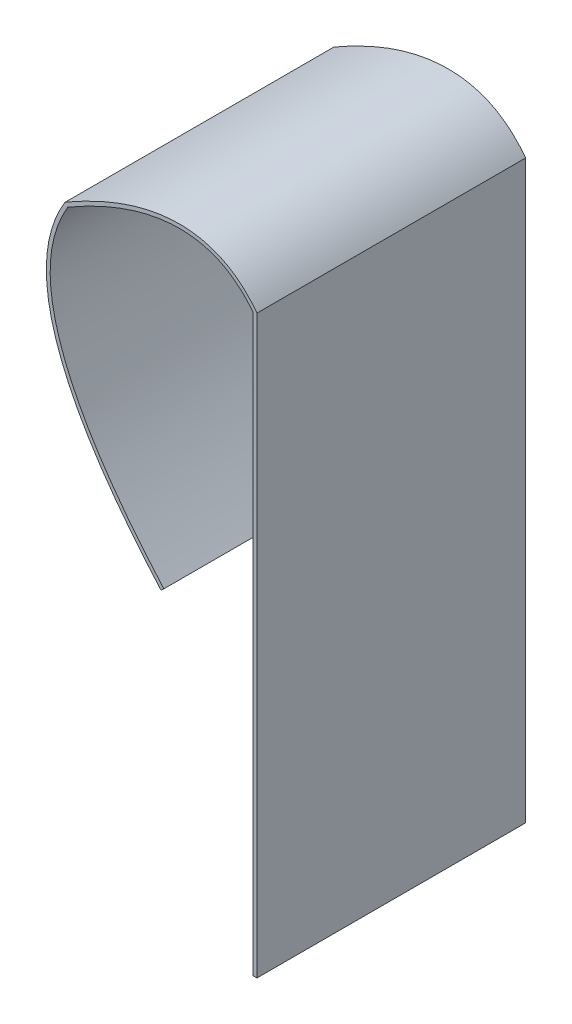
ISO-10303-21;
HEADER;
FILE_DESCRIPTION(('STEP AP214'),'2;1');
FILE_NAME('part.step','',(''),(''),'','','');
FILE_SCHEMA(('AUTOMOTIVE_DESIGN { 1 0 10303 214 1 1 1 1 }'));
ENDSEC;
DATA;
#1=APPLICATION_CONTEXT('core data for automotive mechanical design processes');
#2=APPLICATION_PROTOCOL_DEFINITION('international standard','automotive_design',2000,#1);
#3=PRODUCT_CONTEXT('',#1,'mechanical');
#4=PRODUCT('Part','Part','',(#3));
#5=PRODUCT_RELATED_PRODUCT_CATEGORY('part','',(#4));
#6=PRODUCT_DEFINITION_FORMATION('','',#4);
#7=PRODUCT_DEFINITION_CONTEXT('part definition',#1,'design');
#8=PRODUCT_DEFINITION('design','',#6,#7);
#9=PRODUCT_DEFINITION_SHAPE('','',#8);
#10=(LENGTH_UNIT() NAMED_UNIT(*) SI_UNIT(.MILLI.,.METRE.));
#11=(NAMED_UNIT(*) PLANE_ANGLE_UNIT() SI_UNIT($,.RADIAN.));
#12=(NAMED_UNIT(*) SI_UNIT($,.STERADIAN.) SOLID_ANGLE_UNIT());
#13=UNCERTAINTY_MEASURE_WITH_UNIT(LENGTH_MEASURE(1.E-05),#10,'distance_accuracy_value','');
#14=(GEOMETRIC_REPRESENTATION_CONTEXT(3) GLOBAL_UNCERTAINTY_ASSIGNED_CONTEXT((#13)) GLOBAL_UNIT_ASSIGNED_CONTEXT((#10,
#11,#12)) REPRESENTATION_CONTEXT('',''));
#15=CARTESIAN_POINT('',(0.,0.,0.));
#16=DIRECTION('',(0.,0.,1.));
#17=DIRECTION('',(1.,0.,0.));
#18=AXIS2_PLACEMENT_3D('',#15,#16,#17);
#19=CARTESIAN_POINT('',(2.5,7.5,3.5));
#20=DIRECTION('',(-1.,0.,0.));
#21=DIRECTION('',(0.,-1.,0.));
#22=AXIS2_PLACEMENT_3D('',#19,#20,#21);
#23=PLANE('',#22);
#24=DIRECTION('',(0.,1.,0.));
#25=VECTOR('',#24,1.);
#26=CARTESIAN_POINT('',(2.5,7.5,-3.5));
#27=LINE('',#26,#25);
#28=CARTESIAN_POINT('',(2.5,-7.5,-3.5));
#29=VERTEX_POINT('',#28);
#30=CARTESIAN_POINT('',(2.5,7.5,-3.5));
#31=VERTEX_POINT('',#30);
#32=EDGE_CURVE('E132',#29,#31,#27,.T.);
#33=ORIENTED_EDGE('',*,*,#32,.T.);
#34=DIRECTION('',(0.,0.,-1.));
#35=VECTOR('',#34,1.);
#36=CARTESIAN_POINT('',(2.5,7.5,3.5));
#37=LINE('',#36,#35);
#38=CARTESIAN_POINT('',(2.5,7.5,3.5));
#39=VERTEX_POINT('',#38);
#40=EDGE_CURVE('E11',#39,#31,#37,.T.);
#41=ORIENTED_EDGE('',*,*,#40,.F.);
#42=DIRECTION('',(0.,1.,0.));
#43=VECTOR('',#42,1.);
#44=CARTESIAN_POINT('',(2.5,7.5,3.5));
#45=LINE('',#44,#43);
#46=CARTESIAN_POINT('',(2.5,-7.5,3.5));
#47=VERTEX_POINT('',#46);
#48=EDGE_CURVE('E166',#47,#39,#45,.T.);
#49=ORIENTED_EDGE('',*,*,#48,.F.);
#50=DIRECTION('',(0.,0.,-1.));
#51=VECTOR('',#50,1.);
#52=CARTESIAN_POINT('',(2.5,-7.5,3.5));
#53=LINE('',#52,#51);
#54=EDGE_CURVE('E125',#47,#29,#53,.T.);
#55=ORIENTED_EDGE('',*,*,#54,.T.);
#56=EDGE_LOOP('',(#33,#41,#49,#55));
#57=FACE_BOUND('',#56,.T.);
#58=ADVANCED_FACE('F33',(#57),#23,.F.);
#59=CARTESIAN_POINT('',(2.5,7.5,3.5));
#60=CARTESIAN_POINT('',(2.01260655887463,8.14822429448387,3.5));
#61=CARTESIAN_POINT('',(0.732089956286287,9.38809723966888,3.5));
#62=CARTESIAN_POINT('',(-2.5,7.5,3.5));
#63=B_SPLINE_CURVE_WITH_KNOTS('',3,(#59,#60,#61,#62),.UNSPECIFIED.,.F.,.F.,(4,4),(0.,
0.389137860695649),.UNSPECIFIED.);
#64=DIRECTION('',(0.,0.,-1.));
#65=VECTOR('',#64,1.);
#66=SURFACE_OF_LINEAR_EXTRUSION('',#63,#65);
#67=CARTESIAN_POINT('',(2.5,7.5,-3.5));
#68=CARTESIAN_POINT('',(2.01260655887463,8.14822429448387,-3.5));
#69=CARTESIAN_POINT('',(0.732089956286287,9.38809723966888,-3.5));
#70=CARTESIAN_POINT('',(-2.5,7.5,-3.5));
#71=B_SPLINE_CURVE_WITH_KNOTS('',3,(#67,#68,#69,#70),.UNSPECIFIED.,.F.,.F.,(4,4),(0.,
0.389137860695649),.UNSPECIFIED.);
#72=CARTESIAN_POINT('',(-2.5,7.5,-3.5));
#73=VERTEX_POINT('',#72);
#74=EDGE_CURVE('E135',#31,#73,#71,.T.);
#75=ORIENTED_EDGE('',*,*,#74,.T.);
#76=DIRECTION('',(0.,0.,-1.));
#77=VECTOR('',#76,1.);
#78=CARTESIAN_POINT('',(-2.5,7.5,3.5));
#79=LINE('',#78,#77);
#80=CARTESIAN_POINT('',(-2.5,7.5,3.5));
#81=VERTEX_POINT('',#80);
#82=EDGE_CURVE('E41',#81,#73,#79,.T.);
#83=ORIENTED_EDGE('',*,*,#82,.F.);
#84=EDGE_CURVE('E92',#39,#81,#63,.T.);
#85=ORIENTED_EDGE('',*,*,#84,.F.);
#86=ORIENTED_EDGE('',*,*,#40,.T.);
#87=EDGE_LOOP('',(#75,#83,#85,#86));
#88=FACE_BOUND('',#87,.T.);
#89=ADVANCED_FACE('F210',(#88),#66,.F.);
#90=CARTESIAN_POINT('',(-2.5,7.5,3.5));
#91=CARTESIAN_POINT('',(-4.1911650932924,4.73119521828875,3.5));
#92=CARTESIAN_POINT('',(0.,0.,3.5));
#93=B_SPLINE_CURVE_WITH_KNOTS('',2,(#90,#91,#92),.UNSPECIFIED.,.F.,.F.,(3,3),(0.,1.),.UNSPECIFIED.);
#94=DIRECTION('',(0.,0.,-1.));
#95=VECTOR('',#94,1.);
#96=SURFACE_OF_LINEAR_EXTRUSION('',#93,#95);
#97=CARTESIAN_POINT('',(-2.5,7.5,-3.5));
#98=CARTESIAN_POINT('',(-4.1911650932924,4.73119521828875,-3.5));
#99=CARTESIAN_POINT('',(0.,0.,-3.5));
#100=B_SPLINE_CURVE_WITH_KNOTS('',2,(#97,#98,#99),.UNSPECIFIED.,.F.,.F.,(3,3),(0.,1.),.UNSPECIFIED.);
#101=CARTESIAN_POINT('',(0.,0.,-3.5));
#102=VERTEX_POINT('',#101);
#103=EDGE_CURVE('E139',#73,#102,#100,.T.);
#104=ORIENTED_EDGE('',*,*,#103,.T.);
#105=DIRECTION('',(0.,0.,-1.));
#106=VECTOR('',#105,1.);
#107=CARTESIAN_POINT('',(0.,0.,3.5));
#108=LINE('',#107,#106);
#109=CARTESIAN_POINT('',(0.,0.,3.5));
#110=VERTEX_POINT('',#109);
#111=EDGE_CURVE('E173',#110,#102,#108,.T.);
#112=ORIENTED_EDGE('',*,*,#111,.F.);
#113=EDGE_CURVE('E181',#81,#110,#93,.T.);
#114=ORIENTED_EDGE('',*,*,#113,.F.);
#115=ORIENTED_EDGE('',*,*,#82,.T.);
#116=EDGE_LOOP('',(#104,#112,#114,#115));
#117=FACE_BOUND('',#116,.T.);
#118=ADVANCED_FACE('F179',(#117),#96,.F.);
#119=CARTESIAN_POINT('',(0.,0.,3.5));
#120=DIRECTION('',(-0.663095345687958,0.748534944092103,0.));
#121=DIRECTION('',(-0.748534944092103,-0.663095345687958,0.));
#122=AXIS2_PLACEMENT_3D('',#119,#120,#121);
#123=PLANE('',#122);
#124=DIRECTION('',(0.748534944092103,0.663095345687958,0.));
#125=VECTOR('',#124,1.);
#126=CARTESIAN_POINT('',(0.,0.,-3.5));
#127=LINE('',#126,#125);
#128=CARTESIAN_POINT('',(0.0748534944092103,0.0663095345687958,-3.5));
#129=VERTEX_POINT('',#128);
#130=EDGE_CURVE('E146',#102,#129,#127,.T.);
#131=ORIENTED_EDGE('',*,*,#130,.T.);
#132=DIRECTION('',(0.,0.,-1.));
#133=VECTOR('',#132,1.);
#134=CARTESIAN_POINT('',(0.0748534944092103,0.0663095345687958,3.5));
#135=LINE('',#134,#133);
#136=CARTESIAN_POINT('',(0.0748534944092103,0.0663095345687958,3.5));
#137=VERTEX_POINT('',#136);
#138=EDGE_CURVE('E170',#137,#129,#135,.T.);
#139=ORIENTED_EDGE('',*,*,#138,.F.);
#140=DIRECTION('',(0.748534944092103,0.663095345687958,0.));
#141=VECTOR('',#140,1.);
#142=CARTESIAN_POINT('',(0.,0.,3.5));
#143=LINE('',#142,#141);
#144=EDGE_CURVE('E193',#110,#137,#143,.T.);
#145=ORIENTED_EDGE('',*,*,#144,.F.);
#146=ORIENTED_EDGE('',*,*,#111,.T.);
#147=EDGE_LOOP('',(#131,#139,#145,#146));
#148=FACE_BOUND('',#147,.T.);
#149=ADVANCED_FACE('F189',(#148),#123,.F.);
#150=CARTESIAN_POINT('',(0.0748534944092103,0.0663095345687958,3.5));
#151=CARTESIAN_POINT('',(-0.0937916614033076,0.256684558460054,3.5));
#152=CARTESIAN_POINT('',(-0.431770990992738,0.650252677394547,3.5));
#153=CARTESIAN_POINT('',(-1.03004954556331,1.39777159177519,3.5));
#154=CARTESIAN_POINT('',(-1.66925151987001,2.29960329635751,3.5));
#155=CARTESIAN_POINT('',(-2.25109855011988,3.31555354235717,3.5));
#156=CARTESIAN_POINT('',(-2.78401216049058,4.58671903199248,3.5));
#157=CARTESIAN_POINT('',(-3.00024934784545,6.0044004432962,3.5));
#158=CARTESIAN_POINT('',(-2.68982286336694,6.9899337589872,3.5));
#159=CARTESIAN_POINT('',(-2.42765637145477,7.42641775053006,3.5));
#160=B_SPLINE_CURVE_WITH_KNOTS('',3,(#150,#151,#152,#153,#154,#155,#156,#157,#158,#159),
.UNSPECIFIED.,.F.,.F.,(4,1,1,1,1,1,1,4),(0.,0.0622510019828901,0.12450200396578,
0.24900400793156,0.373506011897341,0.498008015863121,0.747012023794681,0.996016031726241),.UNSPECIFIED.);
#161=DIRECTION('',(0.,0.,-1.));
#162=VECTOR('',#161,1.);
#163=SURFACE_OF_LINEAR_EXTRUSION('',#160,#162);
#164=CARTESIAN_POINT('',(0.0748534944092103,0.0663095345687958,-3.5));
#165=CARTESIAN_POINT('',(-0.0937916614033076,0.256684558460054,-3.5));
#166=CARTESIAN_POINT('',(-0.431770990992738,0.650252677394547,-3.5));
#167=CARTESIAN_POINT('',(-1.03004954556331,1.39777159177519,-3.5));
#168=CARTESIAN_POINT('',(-1.66925151987001,2.29960329635751,-3.5));
#169=CARTESIAN_POINT('',(-2.25109855011988,3.31555354235717,-3.5));
#170=CARTESIAN_POINT('',(-2.78401216049058,4.58671903199248,-3.5));
#171=CARTESIAN_POINT('',(-3.00024934784545,6.0044004432962,-3.5));
#172=CARTESIAN_POINT('',(-2.68982286336694,6.9899337589872,-3.5));
#173=CARTESIAN_POINT('',(-2.42765637145477,7.42641775053006,-3.5));
#174=B_SPLINE_CURVE_WITH_KNOTS('',3,(#164,#165,#166,#167,#168,#169,#170,#171,#172,#173),
.UNSPECIFIED.,.F.,.F.,(4,1,1,1,1,1,1,4),(0.,0.0622510019828901,0.12450200396578,
0.24900400793156,0.373506011897341,0.498008015863121,0.747012023794681,0.996016031726241),.UNSPECIFIED.);
#175=CARTESIAN_POINT('',(-2.42765637145477,7.42641775053006,-3.5));
#176=VERTEX_POINT('',#175);
#177=EDGE_CURVE('E151',#129,#176,#174,.T.);
#178=ORIENTED_EDGE('',*,*,#177,.T.);
#179=DIRECTION('',(0.,0.,-1.));
#180=VECTOR('',#179,1.);
#181=CARTESIAN_POINT('',(-2.42765637145477,7.42641775053006,3.5));
#182=LINE('',#181,#180);
#183=CARTESIAN_POINT('',(-2.42765637145477,7.42641775053006,3.5));
#184=VERTEX_POINT('',#183);
#185=EDGE_CURVE('E120',#184,#176,#182,.T.);
#186=ORIENTED_EDGE('',*,*,#185,.F.);
#187=EDGE_CURVE('E111',#137,#184,#160,.T.);
#188=ORIENTED_EDGE('',*,*,#187,.F.);
#189=ORIENTED_EDGE('',*,*,#138,.T.);
#190=EDGE_LOOP('',(#178,#186,#188,#189));
#191=FACE_BOUND('',#190,.T.);
#192=ADVANCED_FACE('F192',(#191),#163,.F.);
#193=CARTESIAN_POINT('',(-2.42765637145477,7.42641775053006,3.5));
#194=CARTESIAN_POINT('',(-2.24154821482426,7.53461431894103,3.5));
#195=CARTESIAN_POINT('',(-1.84819590077826,7.74839353197915,3.5));
#196=CARTESIAN_POINT('',(-1.15730764581871,8.06652447858552,3.5));
#197=CARTESIAN_POINT('',(-0.38562442267495,8.32105255427388,3.5));
#198=CARTESIAN_POINT('',(0.379329931890445,8.42554015856533,3.5));
#199=CARTESIAN_POINT('',(1.21305628957336,8.35990364217483,3.5));
#200=CARTESIAN_POINT('',(1.79491532107196,8.07510393112839,3.5));
#201=CARTESIAN_POINT('',(2.19788860621591,7.71460788721001,3.5));
#202=CARTESIAN_POINT('',(2.33203136411286,7.55488274497978,3.5));
#203=CARTESIAN_POINT('',(2.39999999999259,7.46632820279148,3.5));
#204=B_SPLINE_CURVE_WITH_KNOTS('',3,(#193,#194,#195,#196,#197,#198,#199,#200,#201,#202,#203),
.UNSPECIFIED.,.F.,.F.,(4,1,1,1,1,1,1,1,4),(0.0008874974873386,0.0248169036973436,
0.0487463099073486,0.0966051223273586,0.144463934747369,0.192322747167379,0.288040372007399,
0.335899184427409,0.383757996847419),.UNSPECIFIED.);
#205=DIRECTION('',(0.,0.,-1.));
#206=VECTOR('',#205,1.);
#207=SURFACE_OF_LINEAR_EXTRUSION('',#204,#206);
#208=CARTESIAN_POINT('',(-2.42765637145477,7.42641775053006,-3.5));
#209=CARTESIAN_POINT('',(-2.24154821482426,7.53461431894103,-3.5));
#210=CARTESIAN_POINT('',(-1.84819590077826,7.74839353197915,-3.5));
#211=CARTESIAN_POINT('',(-1.15730764581871,8.06652447858552,-3.5));
#212=CARTESIAN_POINT('',(-0.38562442267495,8.32105255427388,-3.5));
#213=CARTESIAN_POINT('',(0.379329931890445,8.42554015856533,-3.5));
#214=CARTESIAN_POINT('',(1.21305628957336,8.35990364217483,-3.5));
#215=CARTESIAN_POINT('',(1.79491532107196,8.07510393112839,-3.5));
#216=CARTESIAN_POINT('',(2.19788860621591,7.71460788721001,-3.5));
#217=CARTESIAN_POINT('',(2.33203136411286,7.55488274497978,-3.5));
#218=CARTESIAN_POINT('',(2.39999999999259,7.46632820279148,-3.5));
#219=B_SPLINE_CURVE_WITH_KNOTS('',3,(#208,#209,#210,#211,#212,#213,#214,#215,#216,#217,#218),
.UNSPECIFIED.,.F.,.F.,(4,1,1,1,1,1,1,1,4),(0.0008874974873386,0.0248169036973436,
0.0487463099073486,0.0966051223273586,0.144463934747369,0.192322747167379,0.288040372007399,
0.335899184427409,0.383757996847419),.UNSPECIFIED.);
#220=CARTESIAN_POINT('',(2.39999999999259,7.46632820279148,-3.5));
#221=VERTEX_POINT('',#220);
#222=EDGE_CURVE('E119',#176,#221,#219,.T.);
#223=ORIENTED_EDGE('',*,*,#222,.T.);
#224=DIRECTION('',(0.,0.,-1.));
#225=VECTOR('',#224,1.);
#226=CARTESIAN_POINT('',(2.39999999999259,7.46632820279148,3.5));
#227=LINE('',#226,#225);
#228=CARTESIAN_POINT('',(2.39999999999259,7.46632820279148,3.5));
#229=VERTEX_POINT('',#228);
#230=EDGE_CURVE('E116',#229,#221,#227,.T.);
#231=ORIENTED_EDGE('',*,*,#230,.F.);
#232=EDGE_CURVE('E105',#184,#229,#204,.T.);
#233=ORIENTED_EDGE('',*,*,#232,.F.);
#234=ORIENTED_EDGE('',*,*,#185,.T.);
#235=EDGE_LOOP('',(#223,#231,#233,#234));
#236=FACE_BOUND('',#235,.T.);
#237=ADVANCED_FACE('F117',(#236),#207,.F.);
#238=CARTESIAN_POINT('',(2.39999999999259,7.46632820279148,3.5));
#239=DIRECTION('',(1.,4.94899982226133E-13,0.));
#240=DIRECTION('',(-4.94899982226133E-13,1.,0.));
#241=AXIS2_PLACEMENT_3D('',#238,#239,#240);
#242=PLANE('',#241);
#243=DIRECTION('',(4.94899982226133E-13,-1.,0.));
#244=VECTOR('',#243,1.);
#245=CARTESIAN_POINT('',(2.39999999999259,7.46632820279148,-3.5));
#246=LINE('',#245,#244);
#247=CARTESIAN_POINT('',(2.4,-7.5,-3.5));
#248=VERTEX_POINT('',#247);
#249=EDGE_CURVE('E78',#221,#248,#246,.T.);
#250=ORIENTED_EDGE('',*,*,#249,.T.);
#251=DIRECTION('',(0.,0.,-1.));
#252=VECTOR('',#251,1.);
#253=CARTESIAN_POINT('',(2.4,-7.5,3.5));
#254=LINE('',#253,#252);
#255=CARTESIAN_POINT('',(2.4,-7.5,3.5));
#256=VERTEX_POINT('',#255);
#257=EDGE_CURVE('E121',#256,#248,#254,.T.);
#258=ORIENTED_EDGE('',*,*,#257,.F.);
#259=DIRECTION('',(4.94899982226133E-13,-1.,0.));
#260=VECTOR('',#259,1.);
#261=CARTESIAN_POINT('',(2.39999999999259,7.46632820279148,3.5));
#262=LINE('',#261,#260);
#263=EDGE_CURVE('E109',#229,#256,#262,.T.);
#264=ORIENTED_EDGE('',*,*,#263,.F.);
#265=ORIENTED_EDGE('',*,*,#230,.T.);
#266=EDGE_LOOP('',(#250,#258,#264,#265));
#267=FACE_BOUND('',#266,.T.);
#268=ADVANCED_FACE('F123',(#267),#242,.F.);
#269=CARTESIAN_POINT('',(2.4,-7.5,3.5));
#270=DIRECTION('',(0.,1.,0.));
#271=DIRECTION('',(0.,0.,1.));
#272=AXIS2_PLACEMENT_3D('',#269,#270,#271);
#273=PLANE('',#272);
#274=DIRECTION('',(1.,0.,0.));
#275=VECTOR('',#274,1.);
#276=CARTESIAN_POINT('',(2.4,-7.5,-3.5));
#277=LINE('',#276,#275);
#278=EDGE_CURVE('E84',#248,#29,#277,.T.);
#279=ORIENTED_EDGE('',*,*,#278,.T.);
#280=ORIENTED_EDGE('',*,*,#54,.F.);
#281=DIRECTION('',(1.,0.,0.));
#282=VECTOR('',#281,1.);
#283=CARTESIAN_POINT('',(2.4,-7.5,3.5));
#284=LINE('',#283,#282);
#285=EDGE_CURVE('E49',#256,#47,#284,.T.);
#286=ORIENTED_EDGE('',*,*,#285,.F.);
#287=ORIENTED_EDGE('',*,*,#257,.T.);
#288=EDGE_LOOP('',(#279,#280,#286,#287));
#289=FACE_BOUND('',#288,.T.);
#290=ADVANCED_FACE('F272',(#289),#273,.F.);
#291=CARTESIAN_POINT('',(0.98363575630394,8.35804917171779,3.5));
#292=DIRECTION('',(0.,0.,1.));
#293=DIRECTION('',(1.,0.,0.));
#294=AXIS2_PLACEMENT_3D('',#291,#292,#293);
#295=PLANE('',#294);
#296=ORIENTED_EDGE('',*,*,#48,.T.);
#297=ORIENTED_EDGE('',*,*,#84,.T.);
#298=ORIENTED_EDGE('',*,*,#113,.T.);
#299=ORIENTED_EDGE('',*,*,#144,.T.);
#300=ORIENTED_EDGE('',*,*,#187,.T.);
#301=ORIENTED_EDGE('',*,*,#232,.T.);
#302=ORIENTED_EDGE('',*,*,#263,.T.);
#303=ORIENTED_EDGE('',*,*,#285,.T.);
#304=EDGE_LOOP('',(#296,#297,#298,#299,#300,#301,#302,#303));
#305=FACE_BOUND('',#304,.T.);
#306=ADVANCED_FACE('F107',(#305),#295,.T.);
#307=CARTESIAN_POINT('',(0.98363575630394,8.35804917171779,-3.5));
#308=DIRECTION('',(0.,0.,1.));
#309=DIRECTION('',(1.,0.,0.));
#310=AXIS2_PLACEMENT_3D('',#307,#308,#309);
#311=PLANE('',#310);
#312=ORIENTED_EDGE('',*,*,#32,.F.);
#313=ORIENTED_EDGE('',*,*,#278,.F.);
#314=ORIENTED_EDGE('',*,*,#249,.F.);
#315=ORIENTED_EDGE('',*,*,#222,.F.);
#316=ORIENTED_EDGE('',*,*,#177,.F.);
#317=ORIENTED_EDGE('',*,*,#130,.F.);
#318=ORIENTED_EDGE('',*,*,#103,.F.);
#319=ORIENTED_EDGE('',*,*,#74,.F.);
#320=EDGE_LOOP('',(#312,#313,#314,#315,#316,#317,#318,#319));
#321=FACE_BOUND('',#320,.T.);
#322=ADVANCED_FACE('F185',(#321),#311,.F.);
#323=CLOSED_SHELL('',(#58,#89,#118,#149,#192,#237,#268,#290,#306,#322));
#324=MANIFOLD_SOLID_BREP('B2',#323);
#325=ADVANCED_BREP_SHAPE_REPRESENTATION('',(#18,#324),#14);
#326=SHAPE_DEFINITION_REPRESENTATION(#9,#325);
ENDSEC;
END-ISO-10303-21;
